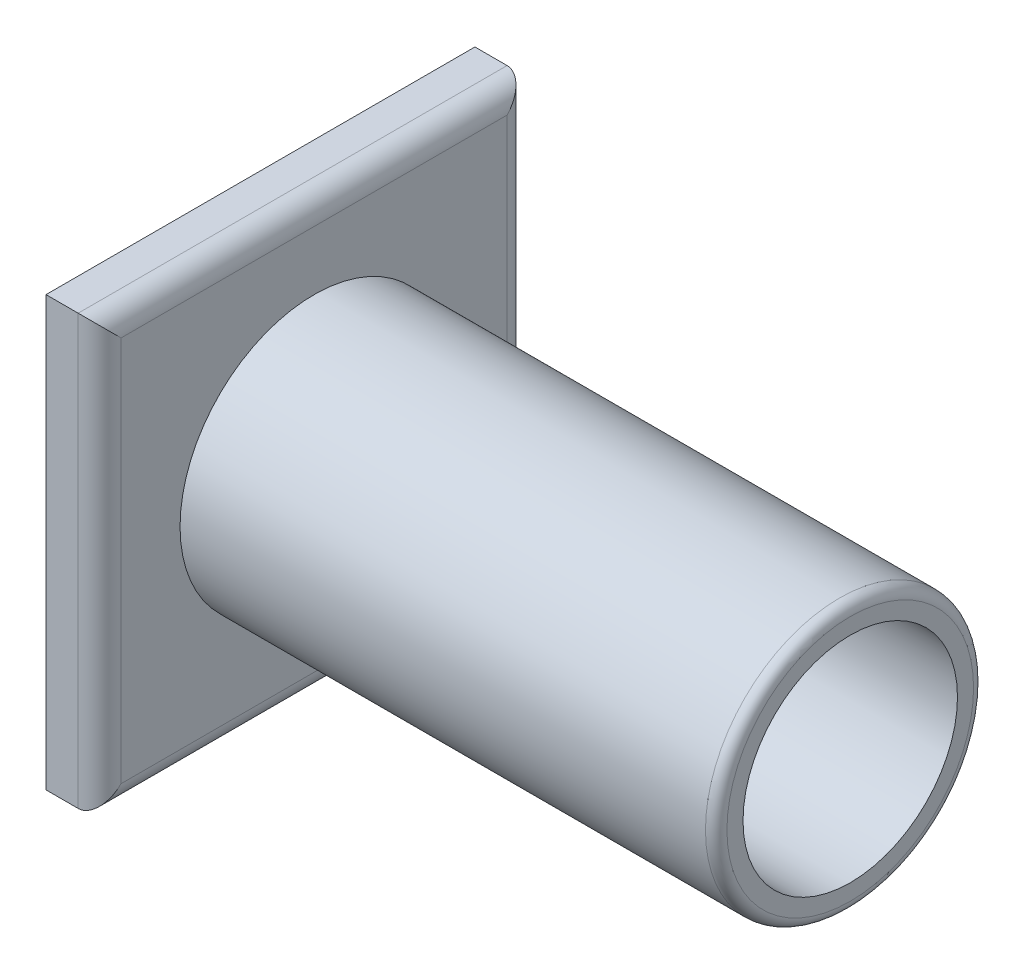
ISO-10303-21;
HEADER;
FILE_DESCRIPTION(('STEP AP214'),'2;1');
FILE_NAME('part.step','',(''),(''),'','','');
FILE_SCHEMA(('AUTOMOTIVE_DESIGN { 1 0 10303 214 1 1 1 1 }'));
ENDSEC;
DATA;
#1=APPLICATION_CONTEXT('core data for automotive mechanical design processes');
#2=APPLICATION_PROTOCOL_DEFINITION('international standard','automotive_design',2000,#1);
#3=PRODUCT_CONTEXT('',#1,'mechanical');
#4=PRODUCT('Part','Part','',(#3));
#5=PRODUCT_RELATED_PRODUCT_CATEGORY('part','',(#4));
#6=PRODUCT_DEFINITION_FORMATION('','',#4);
#7=PRODUCT_DEFINITION_CONTEXT('part definition',#1,'design');
#8=PRODUCT_DEFINITION('design','',#6,#7);
#9=PRODUCT_DEFINITION_SHAPE('','',#8);
#10=(LENGTH_UNIT() NAMED_UNIT(*) SI_UNIT(.MILLI.,.METRE.));
#11=(NAMED_UNIT(*) PLANE_ANGLE_UNIT() SI_UNIT($,.RADIAN.));
#12=(NAMED_UNIT(*) SI_UNIT($,.STERADIAN.) SOLID_ANGLE_UNIT());
#13=UNCERTAINTY_MEASURE_WITH_UNIT(LENGTH_MEASURE(1.E-05),#10,'distance_accuracy_value','');
#14=(GEOMETRIC_REPRESENTATION_CONTEXT(3) GLOBAL_UNCERTAINTY_ASSIGNED_CONTEXT((#13)) GLOBAL_UNIT_ASSIGNED_CONTEXT((#10,
#11,#12)) REPRESENTATION_CONTEXT('',''));
#15=CARTESIAN_POINT('',(0.,0.,0.));
#16=DIRECTION('',(0.,0.,1.));
#17=DIRECTION('',(1.,0.,0.));
#18=AXIS2_PLACEMENT_3D('',#15,#16,#17);
#19=CARTESIAN_POINT('',(100.,-400.,-400.));
#20=DIRECTION('',(0.,0.,1.));
#21=DIRECTION('',(1.,0.,0.));
#22=AXIS2_PLACEMENT_3D('',#19,#20,#21);
#23=PLANE('',#22);
#24=DIRECTION('',(-1.,0.,0.));
#25=VECTOR('',#24,1.);
#26=CARTESIAN_POINT('',(100.,400.,-400.));
#27=LINE('',#26,#25);
#28=CARTESIAN_POINT('',(60.,400.,-400.));
#29=VERTEX_POINT('',#28);
#30=CARTESIAN_POINT('',(0.,400.,-400.));
#31=VERTEX_POINT('',#30);
#32=EDGE_CURVE('E106',#29,#31,#27,.T.);
#33=ORIENTED_EDGE('',*,*,#32,.F.);
#34=DIRECTION('',(0.,1.,0.));
#35=VECTOR('',#34,1.);
#36=CARTESIAN_POINT('',(60.,-400.,-400.));
#37=LINE('',#36,#35);
#38=CARTESIAN_POINT('',(60.,-400.,-400.));
#39=VERTEX_POINT('',#38);
#40=EDGE_CURVE('E76',#29,#39,#37,.F.);
#41=ORIENTED_EDGE('',*,*,#40,.T.);
#42=DIRECTION('',(-1.,0.,0.));
#43=VECTOR('',#42,1.);
#44=CARTESIAN_POINT('',(100.,-400.,-400.));
#45=LINE('',#44,#43);
#46=CARTESIAN_POINT('',(0.,-400.,-400.));
#47=VERTEX_POINT('',#46);
#48=EDGE_CURVE('E125',#39,#47,#45,.T.);
#49=ORIENTED_EDGE('',*,*,#48,.T.);
#50=DIRECTION('',(0.,1.,0.));
#51=VECTOR('',#50,1.);
#52=CARTESIAN_POINT('',(0.,-400.,-400.));
#53=LINE('',#52,#51);
#54=EDGE_CURVE('E120',#47,#31,#53,.T.);
#55=ORIENTED_EDGE('',*,*,#54,.T.);
#56=EDGE_LOOP('',(#33,#41,#49,#55));
#57=FACE_BOUND('',#56,.T.);
#58=ADVANCED_FACE('F53',(#57),#23,.F.);
#59=CARTESIAN_POINT('',(100.,400.,400.));
#60=DIRECTION('',(0.,-1.,0.));
#61=DIRECTION('',(0.,0.,-1.));
#62=AXIS2_PLACEMENT_3D('',#59,#60,#61);
#63=PLANE('',#62);
#64=DIRECTION('',(-1.,0.,0.));
#65=VECTOR('',#64,1.);
#66=CARTESIAN_POINT('',(100.,400.,400.));
#67=LINE('',#66,#65);
#68=CARTESIAN_POINT('',(60.,400.,400.));
#69=VERTEX_POINT('',#68);
#70=CARTESIAN_POINT('',(0.,400.,400.));
#71=VERTEX_POINT('',#70);
#72=EDGE_CURVE('E114',#69,#71,#67,.T.);
#73=ORIENTED_EDGE('',*,*,#72,.F.);
#74=DIRECTION('',(0.,0.,1.));
#75=VECTOR('',#74,1.);
#76=CARTESIAN_POINT('',(60.,400.,400.));
#77=LINE('',#76,#75);
#78=EDGE_CURVE('E69',#69,#29,#77,.F.);
#79=ORIENTED_EDGE('',*,*,#78,.T.);
#80=ORIENTED_EDGE('',*,*,#32,.T.);
#81=DIRECTION('',(0.,0.,1.));
#82=VECTOR('',#81,1.);
#83=CARTESIAN_POINT('',(0.,400.,400.));
#84=LINE('',#83,#82);
#85=EDGE_CURVE('E109',#31,#71,#84,.T.);
#86=ORIENTED_EDGE('',*,*,#85,.T.);
#87=EDGE_LOOP('',(#73,#79,#80,#86));
#88=FACE_BOUND('',#87,.T.);
#89=ADVANCED_FACE('F108',(#88),#63,.F.);
#90=CARTESIAN_POINT('',(100.,-400.,400.));
#91=DIRECTION('',(0.,0.,-1.));
#92=DIRECTION('',(-1.,0.,0.));
#93=AXIS2_PLACEMENT_3D('',#90,#91,#92);
#94=PLANE('',#93);
#95=DIRECTION('',(-1.,0.,0.));
#96=VECTOR('',#95,1.);
#97=CARTESIAN_POINT('',(100.,-400.,400.));
#98=LINE('',#97,#96);
#99=CARTESIAN_POINT('',(60.,-400.,400.));
#100=VERTEX_POINT('',#99);
#101=CARTESIAN_POINT('',(0.,-400.,400.));
#102=VERTEX_POINT('',#101);
#103=EDGE_CURVE('E143',#100,#102,#98,.T.);
#104=ORIENTED_EDGE('',*,*,#103,.F.);
#105=DIRECTION('',(0.,-1.,0.));
#106=VECTOR('',#105,1.);
#107=CARTESIAN_POINT('',(60.,-400.,400.));
#108=LINE('',#107,#106);
#109=EDGE_CURVE('E164',#100,#69,#108,.F.);
#110=ORIENTED_EDGE('',*,*,#109,.T.);
#111=ORIENTED_EDGE('',*,*,#72,.T.);
#112=DIRECTION('',(0.,-1.,0.));
#113=VECTOR('',#112,1.);
#114=CARTESIAN_POINT('',(0.,-400.,400.));
#115=LINE('',#114,#113);
#116=EDGE_CURVE('E122',#71,#102,#115,.T.);
#117=ORIENTED_EDGE('',*,*,#116,.T.);
#118=EDGE_LOOP('',(#104,#110,#111,#117));
#119=FACE_BOUND('',#118,.T.);
#120=ADVANCED_FACE('F212',(#119),#94,.F.);
#121=CARTESIAN_POINT('',(100.,-400.,400.));
#122=DIRECTION('',(0.,1.,0.));
#123=DIRECTION('',(0.,0.,1.));
#124=AXIS2_PLACEMENT_3D('',#121,#122,#123);
#125=PLANE('',#124);
#126=ORIENTED_EDGE('',*,*,#48,.F.);
#127=DIRECTION('',(0.,0.,-1.));
#128=VECTOR('',#127,1.);
#129=CARTESIAN_POINT('',(60.,-400.,400.));
#130=LINE('',#129,#128);
#131=EDGE_CURVE('E168',#39,#100,#130,.F.);
#132=ORIENTED_EDGE('',*,*,#131,.T.);
#133=ORIENTED_EDGE('',*,*,#103,.T.);
#134=DIRECTION('',(0.,0.,-1.));
#135=VECTOR('',#134,1.);
#136=CARTESIAN_POINT('',(0.,-400.,400.));
#137=LINE('',#136,#135);
#138=EDGE_CURVE('E138',#102,#47,#137,.T.);
#139=ORIENTED_EDGE('',*,*,#138,.T.);
#140=EDGE_LOOP('',(#126,#132,#133,#139));
#141=FACE_BOUND('',#140,.T.);
#142=ADVANCED_FACE('F241',(#141),#125,.F.);
#143=CARTESIAN_POINT('',(100.,0.,0.));
#144=DIRECTION('',(-1.,0.,0.));
#145=DIRECTION('',(0.,0.,1.));
#146=AXIS2_PLACEMENT_3D('',#143,#144,#145);
#147=PLANE('',#146);
#148=DIRECTION('',(0.,0.,1.));
#149=VECTOR('',#148,1.);
#150=CARTESIAN_POINT('',(100.,360.,0.));
#151=LINE('',#150,#149);
#152=CARTESIAN_POINT('',(100.,360.,-360.));
#153=VERTEX_POINT('',#152);
#154=CARTESIAN_POINT('',(100.,360.,360.));
#155=VERTEX_POINT('',#154);
#156=EDGE_CURVE('E154',#153,#155,#151,.T.);
#157=ORIENTED_EDGE('',*,*,#156,.T.);
#158=DIRECTION('',(0.,-1.,0.));
#159=VECTOR('',#158,1.);
#160=CARTESIAN_POINT('',(100.,0.,360.));
#161=LINE('',#160,#159);
#162=CARTESIAN_POINT('',(100.,-360.,360.));
#163=VERTEX_POINT('',#162);
#164=EDGE_CURVE('E160',#155,#163,#161,.T.);
#165=ORIENTED_EDGE('',*,*,#164,.T.);
#166=DIRECTION('',(0.,0.,-1.));
#167=VECTOR('',#166,1.);
#168=CARTESIAN_POINT('',(100.,-360.,0.));
#169=LINE('',#168,#167);
#170=CARTESIAN_POINT('',(100.,-360.,-360.));
#171=VERTEX_POINT('',#170);
#172=EDGE_CURVE('E157',#163,#171,#169,.T.);
#173=ORIENTED_EDGE('',*,*,#172,.T.);
#174=DIRECTION('',(0.,1.,0.));
#175=VECTOR('',#174,1.);
#176=CARTESIAN_POINT('',(100.,0.,-360.));
#177=LINE('',#176,#175);
#178=EDGE_CURVE('E151',#171,#153,#177,.T.);
#179=ORIENTED_EDGE('',*,*,#178,.T.);
#180=EDGE_LOOP('',(#157,#165,#173,#179));
#181=FACE_BOUND('',#180,.T.);
#182=CARTESIAN_POINT('',(100.,0.,0.));
#183=DIRECTION('',(-1.,0.,0.));
#184=DIRECTION('',(0.,0.,1.));
#185=AXIS2_PLACEMENT_3D('',#182,#183,#184);
#186=CIRCLE('',#185,250.);
#187=CARTESIAN_POINT('',(100.,0.,250.));
#188=VERTEX_POINT('',#187);
#189=EDGE_CURVE('E113',#188,#188,#186,.F.);
#190=ORIENTED_EDGE('',*,*,#189,.F.);
#191=EDGE_LOOP('',(#190));
#192=FACE_BOUND('',#191,.T.);
#193=ADVANCED_FACE('F232',(#181,#192),#147,.F.);
#194=CARTESIAN_POINT('',(0.,0.,0.));
#195=DIRECTION('',(-1.,0.,0.));
#196=DIRECTION('',(0.,0.,1.));
#197=AXIS2_PLACEMENT_3D('',#194,#195,#196);
#198=PLANE('',#197);
#199=ORIENTED_EDGE('',*,*,#54,.F.);
#200=ORIENTED_EDGE('',*,*,#138,.F.);
#201=ORIENTED_EDGE('',*,*,#116,.F.);
#202=ORIENTED_EDGE('',*,*,#85,.F.);
#203=EDGE_LOOP('',(#199,#200,#201,#202));
#204=FACE_BOUND('',#203,.T.);
#205=ADVANCED_FACE('F118',(#204),#198,.T.);
#206=CARTESIAN_POINT('',(1100.,0.,0.));
#207=DIRECTION('',(1.,0.,0.));
#208=DIRECTION('',(0.,0.,-1.));
#209=AXIS2_PLACEMENT_3D('',#206,#207,#208);
#210=PLANE('',#209);
#211=CARTESIAN_POINT('',(1100.,0.,0.));
#212=DIRECTION('',(1.,0.,0.));
#213=DIRECTION('',(0.,0.,-1.));
#214=AXIS2_PLACEMENT_3D('',#211,#212,#213);
#215=CIRCLE('',#214,230.);
#216=CARTESIAN_POINT('',(1100.,0.,-230.));
#217=VERTEX_POINT('',#216);
#218=EDGE_CURVE('E62',#217,#217,#215,.T.);
#219=ORIENTED_EDGE('',*,*,#218,.T.);
#220=EDGE_LOOP('',(#219));
#221=FACE_BOUND('',#220,.T.);
#222=CARTESIAN_POINT('',(1100.,0.,0.));
#223=DIRECTION('',(1.,0.,0.));
#224=DIRECTION('',(0.,0.,-1.));
#225=AXIS2_PLACEMENT_3D('',#222,#223,#224);
#226=CIRCLE('',#225,200.);
#227=CARTESIAN_POINT('',(1100.,0.,-200.));
#228=VERTEX_POINT('',#227);
#229=EDGE_CURVE('E128',#228,#228,#226,.T.);
#230=ORIENTED_EDGE('',*,*,#229,.F.);
#231=EDGE_LOOP('',(#230));
#232=FACE_BOUND('',#231,.T.);
#233=ADVANCED_FACE('F192',(#221,#232),#210,.T.);
#234=CARTESIAN_POINT('',(1100.,0.,0.));
#235=DIRECTION('',(-1.,0.,0.));
#236=DIRECTION('',(0.,0.,1.));
#237=AXIS2_PLACEMENT_3D('',#234,#235,#236);
#238=CYLINDRICAL_SURFACE('',#237,250.);
#239=CARTESIAN_POINT('',(1080.,0.,0.));
#240=DIRECTION('',(1.,0.,0.));
#241=DIRECTION('',(0.,0.,-1.));
#242=AXIS2_PLACEMENT_3D('',#239,#240,#241);
#243=CIRCLE('',#242,250.);
#244=CARTESIAN_POINT('',(1080.,0.,-250.));
#245=VERTEX_POINT('',#244);
#246=EDGE_CURVE('E11',#245,#245,#243,.F.);
#247=ORIENTED_EDGE('',*,*,#246,.T.);
#248=EDGE_LOOP('',(#247));
#249=FACE_BOUND('',#248,.T.);
#250=ORIENTED_EDGE('',*,*,#189,.T.);
#251=EDGE_LOOP('',(#250));
#252=FACE_BOUND('',#251,.T.);
#253=ADVANCED_FACE('F252',(#249,#252),#238,.T.);
#254=CARTESIAN_POINT('',(1100.,0.,0.));
#255=DIRECTION('',(-1.,0.,0.));
#256=DIRECTION('',(0.,0.,1.));
#257=AXIS2_PLACEMENT_3D('',#254,#255,#256);
#258=CYLINDRICAL_SURFACE('',#257,200.);
#259=ORIENTED_EDGE('',*,*,#229,.T.);
#260=EDGE_LOOP('',(#259));
#261=FACE_BOUND('',#260,.T.);
#262=CARTESIAN_POINT('',(100.,0.,0.));
#263=DIRECTION('',(1.,0.,0.));
#264=DIRECTION('',(0.,0.,-1.));
#265=AXIS2_PLACEMENT_3D('',#262,#263,#264);
#266=CIRCLE('',#265,200.);
#267=CARTESIAN_POINT('',(100.,0.,-200.));
#268=VERTEX_POINT('',#267);
#269=EDGE_CURVE('E132',#268,#268,#266,.T.);
#270=ORIENTED_EDGE('',*,*,#269,.F.);
#271=EDGE_LOOP('',(#270));
#272=FACE_BOUND('',#271,.T.);
#273=ADVANCED_FACE('F229',(#261,#272),#258,.F.);
#274=ORIENTED_EDGE('',*,*,#269,.T.);
#275=EDGE_LOOP('',(#274));
#276=FACE_BOUND('',#275,.T.);
#277=ADVANCED_FACE('F224',(#276),#147,.F.);
#278=CARTESIAN_POINT('',(60.,0.,-360.));
#279=DIRECTION('',(0.,1.,0.));
#280=DIRECTION('',(0.,0.,1.));
#281=AXIS2_PLACEMENT_3D('',#278,#279,#280);
#282=CYLINDRICAL_SURFACE('',#281,40.);
#283=CARTESIAN_POINT('',(60.,-360.,-360.));
#284=DIRECTION('',(0.,0.707106781186547,-0.707106781186547));
#285=DIRECTION('',(0.,0.707106781186547,0.707106781186547));
#286=AXIS2_PLACEMENT_3D('',#283,#284,#285);
#287=ELLIPSE('',#286,56.5685424949238,40.);
#288=EDGE_CURVE('E181',#39,#171,#287,.F.);
#289=ORIENTED_EDGE('',*,*,#288,.F.);
#290=ORIENTED_EDGE('',*,*,#40,.F.);
#291=CARTESIAN_POINT('',(60.,360.,-360.));
#292=DIRECTION('',(0.,0.707106781186547,0.707106781186547));
#293=DIRECTION('',(0.,0.707106781186547,-0.707106781186547));
#294=AXIS2_PLACEMENT_3D('',#291,#292,#293);
#295=ELLIPSE('',#294,56.5685424949238,40.);
#296=EDGE_CURVE('E185',#153,#29,#295,.T.);
#297=ORIENTED_EDGE('',*,*,#296,.F.);
#298=ORIENTED_EDGE('',*,*,#178,.F.);
#299=EDGE_LOOP('',(#289,#290,#297,#298));
#300=FACE_BOUND('',#299,.T.);
#301=ADVANCED_FACE('F221',(#300),#282,.T.);
#302=CARTESIAN_POINT('',(60.,360.,0.));
#303=DIRECTION('',(0.,0.,1.));
#304=DIRECTION('',(1.,0.,0.));
#305=AXIS2_PLACEMENT_3D('',#302,#303,#304);
#306=CYLINDRICAL_SURFACE('',#305,40.);
#307=ORIENTED_EDGE('',*,*,#296,.T.);
#308=ORIENTED_EDGE('',*,*,#78,.F.);
#309=CARTESIAN_POINT('',(60.,360.,360.));
#310=DIRECTION('',(0.,-0.707106781186547,0.707106781186547));
#311=DIRECTION('',(0.,0.707106781186547,0.707106781186547));
#312=AXIS2_PLACEMENT_3D('',#309,#310,#311);
#313=ELLIPSE('',#312,56.5685424949238,40.);
#314=EDGE_CURVE('E178',#155,#69,#313,.T.);
#315=ORIENTED_EDGE('',*,*,#314,.F.);
#316=ORIENTED_EDGE('',*,*,#156,.F.);
#317=EDGE_LOOP('',(#307,#308,#315,#316));
#318=FACE_BOUND('',#317,.T.);
#319=ADVANCED_FACE('F218',(#318),#306,.T.);
#320=CARTESIAN_POINT('',(60.,-360.,0.));
#321=DIRECTION('',(0.,0.,-1.));
#322=DIRECTION('',(-1.,0.,0.));
#323=AXIS2_PLACEMENT_3D('',#320,#321,#322);
#324=CYLINDRICAL_SURFACE('',#323,40.);
#325=ORIENTED_EDGE('',*,*,#288,.T.);
#326=ORIENTED_EDGE('',*,*,#172,.F.);
#327=CARTESIAN_POINT('',(60.,-360.,360.));
#328=DIRECTION('',(0.,-0.707106781186547,-0.707106781186547));
#329=DIRECTION('',(0.,0.707106781186547,-0.707106781186547));
#330=AXIS2_PLACEMENT_3D('',#327,#328,#329);
#331=ELLIPSE('',#330,56.5685424949238,40.);
#332=EDGE_CURVE('E175',#100,#163,#331,.F.);
#333=ORIENTED_EDGE('',*,*,#332,.F.);
#334=ORIENTED_EDGE('',*,*,#131,.F.);
#335=EDGE_LOOP('',(#325,#326,#333,#334));
#336=FACE_BOUND('',#335,.T.);
#337=ADVANCED_FACE('F202',(#336),#324,.T.);
#338=CARTESIAN_POINT('',(60.,0.,360.));
#339=DIRECTION('',(0.,-1.,0.));
#340=DIRECTION('',(0.,0.,-1.));
#341=AXIS2_PLACEMENT_3D('',#338,#339,#340);
#342=CYLINDRICAL_SURFACE('',#341,40.);
#343=ORIENTED_EDGE('',*,*,#314,.T.);
#344=ORIENTED_EDGE('',*,*,#109,.F.);
#345=ORIENTED_EDGE('',*,*,#332,.T.);
#346=ORIENTED_EDGE('',*,*,#164,.F.);
#347=EDGE_LOOP('',(#343,#344,#345,#346));
#348=FACE_BOUND('',#347,.T.);
#349=ADVANCED_FACE('F196',(#348),#342,.T.);
#350=CARTESIAN_POINT('',(1080.,0.,0.));
#351=DIRECTION('',(1.,0.,0.));
#352=DIRECTION('',(0.,0.,-1.));
#353=AXIS2_PLACEMENT_3D('',#350,#351,#352);
#354=TOROIDAL_SURFACE('',#353,230.,20.);
#355=ORIENTED_EDGE('',*,*,#246,.F.);
#356=EDGE_LOOP('',(#355));
#357=FACE_BOUND('',#356,.T.);
#358=ORIENTED_EDGE('',*,*,#218,.F.);
#359=EDGE_LOOP('',(#358));
#360=FACE_BOUND('',#359,.T.);
#361=ADVANCED_FACE('F55',(#357,#360),#354,.T.);
#362=CLOSED_SHELL('',(#58,#89,#120,#142,#193,#205,#233,#253,#273,#277,#301,#319,#337,#349,#361));
#363=MANIFOLD_SOLID_BREP('B2',#362);
#364=ADVANCED_BREP_SHAPE_REPRESENTATION('',(#18,#363),#14);
#365=SHAPE_DEFINITION_REPRESENTATION(#9,#364);
ENDSEC;
END-ISO-10303-21;
